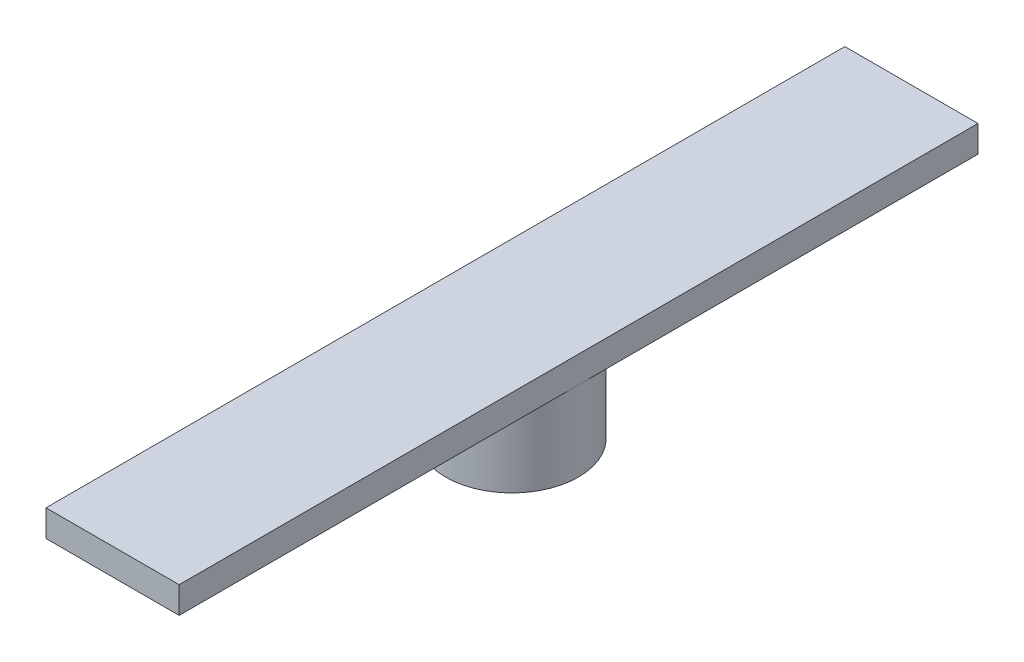
ISO-10303-21;
HEADER;
FILE_DESCRIPTION(('STEP AP214'),'2;1');
FILE_NAME('part.step','',(''),(''),'','','');
FILE_SCHEMA(('AUTOMOTIVE_DESIGN { 1 0 10303 214 1 1 1 1 }'));
ENDSEC;
DATA;
#1=APPLICATION_CONTEXT('core data for automotive mechanical design processes');
#2=APPLICATION_PROTOCOL_DEFINITION('international standard','automotive_design',2000,#1);
#3=PRODUCT_CONTEXT('',#1,'mechanical');
#4=PRODUCT('Part','Part','',(#3));
#5=PRODUCT_RELATED_PRODUCT_CATEGORY('part','',(#4));
#6=PRODUCT_DEFINITION_FORMATION('','',#4);
#7=PRODUCT_DEFINITION_CONTEXT('part definition',#1,'design');
#8=PRODUCT_DEFINITION('design','',#6,#7);
#9=PRODUCT_DEFINITION_SHAPE('','',#8);
#10=(LENGTH_UNIT() NAMED_UNIT(*) SI_UNIT(.MILLI.,.METRE.));
#11=(NAMED_UNIT(*) PLANE_ANGLE_UNIT() SI_UNIT($,.RADIAN.));
#12=(NAMED_UNIT(*) SI_UNIT($,.STERADIAN.) SOLID_ANGLE_UNIT());
#13=UNCERTAINTY_MEASURE_WITH_UNIT(LENGTH_MEASURE(1.E-05),#10,'distance_accuracy_value','');
#14=(GEOMETRIC_REPRESENTATION_CONTEXT(3) GLOBAL_UNCERTAINTY_ASSIGNED_CONTEXT((#13)) GLOBAL_UNIT_ASSIGNED_CONTEXT((#10,
#11,#12)) REPRESENTATION_CONTEXT('',''));
#15=CARTESIAN_POINT('',(0.,0.,0.));
#16=DIRECTION('',(0.,0.,1.));
#17=DIRECTION('',(1.,0.,0.));
#18=AXIS2_PLACEMENT_3D('',#15,#16,#17);
#19=CARTESIAN_POINT('',(0.,3.,0.));
#20=DIRECTION('',(0.,-1.,0.));
#21=DIRECTION('',(0.,0.,-1.));
#22=AXIS2_PLACEMENT_3D('',#19,#20,#21);
#23=CYLINDRICAL_SURFACE('',#22,2.5);
#24=CARTESIAN_POINT('',(0.,3.,0.));
#25=DIRECTION('',(0.,1.,0.));
#26=DIRECTION('',(0.,0.,1.));
#27=AXIS2_PLACEMENT_3D('',#24,#25,#26);
#28=CIRCLE('',#27,2.5);
#29=CARTESIAN_POINT('',(2.5,3.,0.));
#30=VERTEX_POINT('',#29);
#31=CARTESIAN_POINT('',(-2.5,3.,0.));
#32=VERTEX_POINT('',#31);
#33=EDGE_CURVE('E11',#30,#32,#28,.T.);
#34=ORIENTED_EDGE('',*,*,#33,.F.);
#35=EDGE_CURVE('E40',#32,#30,#28,.T.);
#36=ORIENTED_EDGE('',*,*,#35,.F.);
#37=EDGE_LOOP('',(#34,#36));
#38=FACE_BOUND('',#37,.T.);
#39=CARTESIAN_POINT('',(0.,0.,0.));
#40=DIRECTION('',(0.,1.,0.));
#41=DIRECTION('',(0.,0.,1.));
#42=AXIS2_PLACEMENT_3D('',#39,#40,#41);
#43=CIRCLE('',#42,2.5);
#44=CARTESIAN_POINT('',(0.,0.,2.5));
#45=VERTEX_POINT('',#44);
#46=EDGE_CURVE('E35',#45,#45,#43,.T.);
#47=ORIENTED_EDGE('',*,*,#46,.T.);
#48=EDGE_LOOP('',(#47));
#49=FACE_BOUND('',#48,.T.);
#50=ADVANCED_FACE('F32',(#38,#49),#23,.T.);
#51=CARTESIAN_POINT('',(0.,0.,0.));
#52=DIRECTION('',(0.,1.,0.));
#53=DIRECTION('',(0.,0.,1.));
#54=AXIS2_PLACEMENT_3D('',#51,#52,#53);
#55=PLANE('',#54);
#56=ORIENTED_EDGE('',*,*,#46,.F.);
#57=EDGE_LOOP('',(#56));
#58=FACE_BOUND('',#57,.T.);
#59=ADVANCED_FACE('F132',(#58),#55,.F.);
#60=CARTESIAN_POINT('',(0.,3.,0.));
#61=DIRECTION('',(0.,-1.,0.));
#62=DIRECTION('',(0.,0.,-1.));
#63=AXIS2_PLACEMENT_3D('',#60,#61,#62);
#64=PLANE('',#63);
#65=DIRECTION('',(0.,0.,-1.));
#66=VECTOR('',#65,1.);
#67=CARTESIAN_POINT('',(2.5,3.,15.));
#68=LINE('',#67,#66);
#69=CARTESIAN_POINT('',(2.5,3.,-15.));
#70=VERTEX_POINT('',#69);
#71=EDGE_CURVE('E97',#30,#70,#68,.T.);
#72=ORIENTED_EDGE('',*,*,#71,.F.);
#73=ORIENTED_EDGE('',*,*,#33,.T.);
#74=DIRECTION('',(0.,0.,1.));
#75=VECTOR('',#74,1.);
#76=CARTESIAN_POINT('',(-2.5,3.,15.));
#77=LINE('',#76,#75);
#78=CARTESIAN_POINT('',(-2.5,3.,-15.));
#79=VERTEX_POINT('',#78);
#80=EDGE_CURVE('E109',#79,#32,#77,.T.);
#81=ORIENTED_EDGE('',*,*,#80,.F.);
#82=DIRECTION('',(-1.,0.,0.));
#83=VECTOR('',#82,1.);
#84=CARTESIAN_POINT('',(-2.5,3.,-15.));
#85=LINE('',#84,#83);
#86=EDGE_CURVE('E113',#70,#79,#85,.T.);
#87=ORIENTED_EDGE('',*,*,#86,.F.);
#88=EDGE_LOOP('',(#72,#73,#81,#87));
#89=FACE_BOUND('',#88,.T.);
#90=ADVANCED_FACE('F129',(#89),#64,.T.);
#91=CARTESIAN_POINT('',(2.5,4.,15.));
#92=DIRECTION('',(-1.,0.,0.));
#93=DIRECTION('',(0.,0.,1.));
#94=AXIS2_PLACEMENT_3D('',#91,#92,#93);
#95=PLANE('',#94);
#96=CARTESIAN_POINT('',(2.5,3.,15.));
#97=VERTEX_POINT('',#96);
#98=EDGE_CURVE('E115',#97,#30,#68,.T.);
#99=ORIENTED_EDGE('',*,*,#98,.T.);
#100=ORIENTED_EDGE('',*,*,#71,.T.);
#101=DIRECTION('',(0.,-1.,0.));
#102=VECTOR('',#101,1.);
#103=CARTESIAN_POINT('',(2.5,4.,-15.));
#104=LINE('',#103,#102);
#105=CARTESIAN_POINT('',(2.5,4.,-15.));
#106=VERTEX_POINT('',#105);
#107=EDGE_CURVE('E77',#106,#70,#104,.T.);
#108=ORIENTED_EDGE('',*,*,#107,.F.);
#109=DIRECTION('',(0.,0.,-1.));
#110=VECTOR('',#109,1.);
#111=CARTESIAN_POINT('',(2.5,4.,15.));
#112=LINE('',#111,#110);
#113=CARTESIAN_POINT('',(2.5,4.,15.));
#114=VERTEX_POINT('',#113);
#115=EDGE_CURVE('E83',#114,#106,#112,.T.);
#116=ORIENTED_EDGE('',*,*,#115,.F.);
#117=DIRECTION('',(0.,-1.,0.));
#118=VECTOR('',#117,1.);
#119=CARTESIAN_POINT('',(2.5,4.,15.));
#120=LINE('',#119,#118);
#121=EDGE_CURVE('E106',#114,#97,#120,.T.);
#122=ORIENTED_EDGE('',*,*,#121,.T.);
#123=EDGE_LOOP('',(#99,#100,#108,#116,#122));
#124=FACE_BOUND('',#123,.T.);
#125=ADVANCED_FACE('F95',(#124),#95,.F.);
#126=CARTESIAN_POINT('',(-2.5,4.,-15.));
#127=DIRECTION('',(0.,0.,1.));
#128=DIRECTION('',(1.,0.,0.));
#129=AXIS2_PLACEMENT_3D('',#126,#127,#128);
#130=PLANE('',#129);
#131=ORIENTED_EDGE('',*,*,#86,.T.);
#132=DIRECTION('',(0.,-1.,0.));
#133=VECTOR('',#132,1.);
#134=CARTESIAN_POINT('',(-2.5,4.,-15.));
#135=LINE('',#134,#133);
#136=CARTESIAN_POINT('',(-2.5,4.,-15.));
#137=VERTEX_POINT('',#136);
#138=EDGE_CURVE('E79',#137,#79,#135,.T.);
#139=ORIENTED_EDGE('',*,*,#138,.F.);
#140=DIRECTION('',(-1.,0.,0.));
#141=VECTOR('',#140,1.);
#142=CARTESIAN_POINT('',(-2.5,4.,-15.));
#143=LINE('',#142,#141);
#144=EDGE_CURVE('E73',#106,#137,#143,.T.);
#145=ORIENTED_EDGE('',*,*,#144,.F.);
#146=ORIENTED_EDGE('',*,*,#107,.T.);
#147=EDGE_LOOP('',(#131,#139,#145,#146));
#148=FACE_BOUND('',#147,.T.);
#149=ADVANCED_FACE('F75',(#148),#130,.F.);
#150=CARTESIAN_POINT('',(-2.5,4.,15.));
#151=DIRECTION('',(1.,0.,0.));
#152=DIRECTION('',(0.,0.,-1.));
#153=AXIS2_PLACEMENT_3D('',#150,#151,#152);
#154=PLANE('',#153);
#155=ORIENTED_EDGE('',*,*,#80,.T.);
#156=CARTESIAN_POINT('',(-2.5,3.,15.));
#157=VERTEX_POINT('',#156);
#158=EDGE_CURVE('E112',#32,#157,#77,.T.);
#159=ORIENTED_EDGE('',*,*,#158,.T.);
#160=DIRECTION('',(0.,-1.,0.));
#161=VECTOR('',#160,1.);
#162=CARTESIAN_POINT('',(-2.5,4.,15.));
#163=LINE('',#162,#161);
#164=CARTESIAN_POINT('',(-2.5,4.,15.));
#165=VERTEX_POINT('',#164);
#166=EDGE_CURVE('E101',#165,#157,#163,.T.);
#167=ORIENTED_EDGE('',*,*,#166,.F.);
#168=DIRECTION('',(0.,0.,1.));
#169=VECTOR('',#168,1.);
#170=CARTESIAN_POINT('',(-2.5,4.,15.));
#171=LINE('',#170,#169);
#172=EDGE_CURVE('E82',#137,#165,#171,.T.);
#173=ORIENTED_EDGE('',*,*,#172,.F.);
#174=ORIENTED_EDGE('',*,*,#138,.T.);
#175=EDGE_LOOP('',(#155,#159,#167,#173,#174));
#176=FACE_BOUND('',#175,.T.);
#177=ADVANCED_FACE('F120',(#176),#154,.F.);
#178=CARTESIAN_POINT('',(-2.5,4.,15.));
#179=DIRECTION('',(0.,0.,-1.));
#180=DIRECTION('',(-1.,0.,0.));
#181=AXIS2_PLACEMENT_3D('',#178,#179,#180);
#182=PLANE('',#181);
#183=DIRECTION('',(1.,0.,0.));
#184=VECTOR('',#183,1.);
#185=CARTESIAN_POINT('',(-2.5,3.,15.));
#186=LINE('',#185,#184);
#187=EDGE_CURVE('E92',#157,#97,#186,.T.);
#188=ORIENTED_EDGE('',*,*,#187,.T.);
#189=ORIENTED_EDGE('',*,*,#121,.F.);
#190=DIRECTION('',(1.,0.,0.));
#191=VECTOR('',#190,1.);
#192=CARTESIAN_POINT('',(-2.5,4.,15.));
#193=LINE('',#192,#191);
#194=EDGE_CURVE('E88',#165,#114,#193,.T.);
#195=ORIENTED_EDGE('',*,*,#194,.F.);
#196=ORIENTED_EDGE('',*,*,#166,.T.);
#197=EDGE_LOOP('',(#188,#189,#195,#196));
#198=FACE_BOUND('',#197,.T.);
#199=ADVANCED_FACE('F124',(#198),#182,.F.);
#200=CARTESIAN_POINT('',(0.,4.,0.));
#201=DIRECTION('',(0.,-1.,0.));
#202=DIRECTION('',(0.,0.,-1.));
#203=AXIS2_PLACEMENT_3D('',#200,#201,#202);
#204=PLANE('',#203);
#205=ORIENTED_EDGE('',*,*,#115,.T.);
#206=ORIENTED_EDGE('',*,*,#144,.T.);
#207=ORIENTED_EDGE('',*,*,#172,.T.);
#208=ORIENTED_EDGE('',*,*,#194,.T.);
#209=EDGE_LOOP('',(#205,#206,#207,#208));
#210=FACE_BOUND('',#209,.T.);
#211=ADVANCED_FACE('F86',(#210),#204,.F.);
#212=ORIENTED_EDGE('',*,*,#158,.F.);
#213=ORIENTED_EDGE('',*,*,#35,.T.);
#214=ORIENTED_EDGE('',*,*,#98,.F.);
#215=ORIENTED_EDGE('',*,*,#187,.F.);
#216=EDGE_LOOP('',(#212,#213,#214,#215));
#217=FACE_BOUND('',#216,.T.);
#218=ADVANCED_FACE('F127',(#217),#64,.T.);
#219=CLOSED_SHELL('',(#50,#59,#90,#125,#149,#177,#199,#211,#218));
#220=MANIFOLD_SOLID_BREP('B2',#219);
#221=ADVANCED_BREP_SHAPE_REPRESENTATION('',(#18,#220),#14);
#222=SHAPE_DEFINITION_REPRESENTATION(#9,#221);
ENDSEC;
END-ISO-10303-21;
